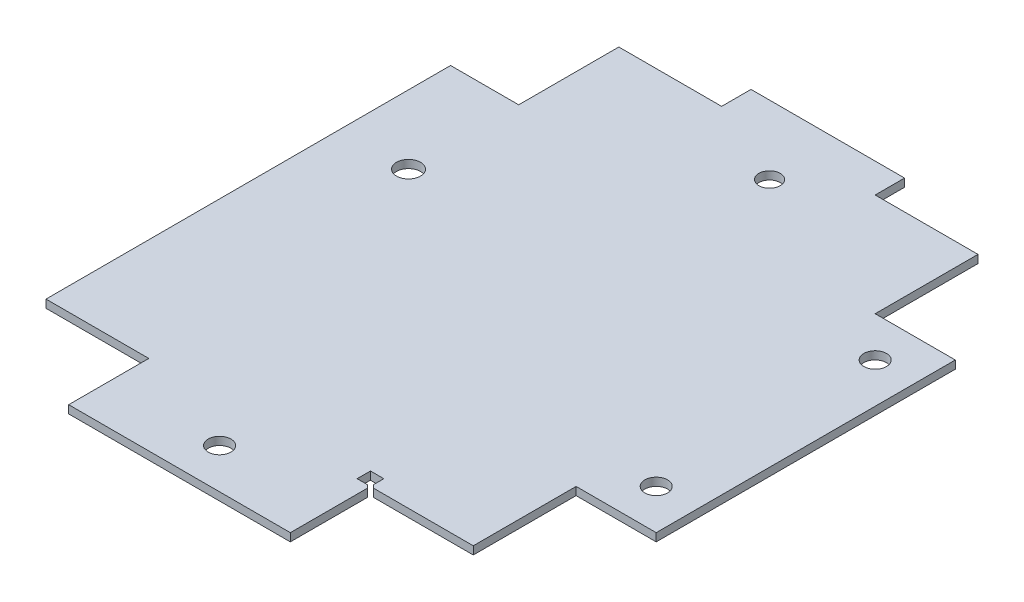
ISO-10303-21;
HEADER;
FILE_DESCRIPTION(('STEP AP214'),'2;1');
FILE_NAME('part.step','',(''),(''),'','','');
FILE_SCHEMA(('AUTOMOTIVE_DESIGN { 1 0 10303 214 1 1 1 1 }'));
ENDSEC;
DATA;
#1=APPLICATION_CONTEXT('core data for automotive mechanical design processes');
#2=APPLICATION_PROTOCOL_DEFINITION('international standard','automotive_design',2000,#1);
#3=PRODUCT_CONTEXT('',#1,'mechanical');
#4=PRODUCT('Part','Part','',(#3));
#5=PRODUCT_RELATED_PRODUCT_CATEGORY('part','',(#4));
#6=PRODUCT_DEFINITION_FORMATION('','',#4);
#7=PRODUCT_DEFINITION_CONTEXT('part definition',#1,'design');
#8=PRODUCT_DEFINITION('design','',#6,#7);
#9=PRODUCT_DEFINITION_SHAPE('','',#8);
#10=(LENGTH_UNIT() NAMED_UNIT(*) SI_UNIT(.MILLI.,.METRE.));
#11=(NAMED_UNIT(*) PLANE_ANGLE_UNIT() SI_UNIT($,.RADIAN.));
#12=(NAMED_UNIT(*) SI_UNIT($,.STERADIAN.) SOLID_ANGLE_UNIT());
#13=UNCERTAINTY_MEASURE_WITH_UNIT(LENGTH_MEASURE(1.E-05),#10,'distance_accuracy_value','');
#14=(GEOMETRIC_REPRESENTATION_CONTEXT(3) GLOBAL_UNCERTAINTY_ASSIGNED_CONTEXT((#13)) GLOBAL_UNIT_ASSIGNED_CONTEXT((#10,
#11,#12)) REPRESENTATION_CONTEXT('',''));
#15=CARTESIAN_POINT('',(0.,0.,0.));
#16=DIRECTION('',(0.,0.,1.));
#17=DIRECTION('',(1.,0.,0.));
#18=AXIS2_PLACEMENT_3D('',#15,#16,#17);
#19=CARTESIAN_POINT('',(94.9999999999999,3.,-115.));
#20=DIRECTION('',(-1.,0.,0.));
#21=DIRECTION('',(0.,0.,1.));
#22=AXIS2_PLACEMENT_3D('',#19,#20,#21);
#23=PLANE('',#22);
#24=DIRECTION('',(0.,0.,-1.));
#25=VECTOR('',#24,1.);
#26=CARTESIAN_POINT('',(94.9999999999999,0.,-115.));
#27=LINE('',#26,#25);
#28=CARTESIAN_POINT('',(95.,0.,46.5));
#29=VERTEX_POINT('',#28);
#30=CARTESIAN_POINT('',(94.9999999999999,0.,-65.5));
#31=VERTEX_POINT('',#30);
#32=EDGE_CURVE('E242',#29,#31,#27,.T.);
#33=ORIENTED_EDGE('',*,*,#32,.T.);
#34=DIRECTION('',(0.,1.,0.));
#35=VECTOR('',#34,1.);
#36=CARTESIAN_POINT('',(94.9999999999999,-7.,-65.5));
#37=LINE('',#36,#35);
#38=CARTESIAN_POINT('',(94.9999999999999,3.,-65.5));
#39=VERTEX_POINT('',#38);
#40=EDGE_CURVE('E477',#31,#39,#37,.T.);
#41=ORIENTED_EDGE('',*,*,#40,.T.);
#42=DIRECTION('',(0.,0.,-1.));
#43=VECTOR('',#42,1.);
#44=CARTESIAN_POINT('',(94.9999999999999,3.,-115.));
#45=LINE('',#44,#43);
#46=CARTESIAN_POINT('',(95.,3.,46.5));
#47=VERTEX_POINT('',#46);
#48=EDGE_CURVE('E227',#47,#39,#45,.T.);
#49=ORIENTED_EDGE('',*,*,#48,.F.);
#50=DIRECTION('',(0.,1.,0.));
#51=VECTOR('',#50,1.);
#52=CARTESIAN_POINT('',(95.,-7.,46.5));
#53=LINE('',#52,#51);
#54=EDGE_CURVE('E432',#29,#47,#53,.T.);
#55=ORIENTED_EDGE('',*,*,#54,.F.);
#56=EDGE_LOOP('',(#33,#41,#49,#55));
#57=FACE_BOUND('',#56,.T.);
#58=ADVANCED_FACE('F40',(#57),#23,.F.);
#59=CARTESIAN_POINT('',(-95.0000000000001,3.,-115.));
#60=DIRECTION('',(0.,0.,1.));
#61=DIRECTION('',(1.,0.,0.));
#62=AXIS2_PLACEMENT_3D('',#59,#60,#61);
#63=PLANE('',#62);
#64=DIRECTION('',(-1.,0.,0.));
#65=VECTOR('',#64,1.);
#66=CARTESIAN_POINT('',(-95.0000000000001,3.,-115.));
#67=LINE('',#66,#65);
#68=CARTESIAN_POINT('',(26.4999999999999,3.,-115.));
#69=VERTEX_POINT('',#68);
#70=CARTESIAN_POINT('',(-31.0000000000001,3.,-115.));
#71=VERTEX_POINT('',#70);
#72=EDGE_CURVE('E216',#69,#71,#67,.T.);
#73=ORIENTED_EDGE('',*,*,#72,.F.);
#74=DIRECTION('',(0.,1.,0.));
#75=VECTOR('',#74,1.);
#76=CARTESIAN_POINT('',(26.4999999999999,-27.,-115.));
#77=LINE('',#76,#75);
#78=CARTESIAN_POINT('',(26.4999999999999,0.,-115.));
#79=VERTEX_POINT('',#78);
#80=EDGE_CURVE('E201',#79,#69,#77,.T.);
#81=ORIENTED_EDGE('',*,*,#80,.F.);
#82=DIRECTION('',(-1.,0.,0.));
#83=VECTOR('',#82,1.);
#84=CARTESIAN_POINT('',(-95.0000000000001,0.,-115.));
#85=LINE('',#84,#83);
#86=CARTESIAN_POINT('',(-31.0000000000001,0.,-115.));
#87=VERTEX_POINT('',#86);
#88=EDGE_CURVE('E246',#79,#87,#85,.T.);
#89=ORIENTED_EDGE('',*,*,#88,.T.);
#90=DIRECTION('',(0.,1.,0.));
#91=VECTOR('',#90,1.);
#92=CARTESIAN_POINT('',(-31.0000000000001,-7.,-115.));
#93=LINE('',#92,#91);
#94=EDGE_CURVE('E224',#87,#71,#93,.T.);
#95=ORIENTED_EDGE('',*,*,#94,.T.);
#96=EDGE_LOOP('',(#73,#81,#89,#95));
#97=FACE_BOUND('',#96,.T.);
#98=ADVANCED_FACE('F222',(#97),#63,.F.);
#99=CARTESIAN_POINT('',(-95.0000000000001,3.,-115.));
#100=DIRECTION('',(1.,0.,0.));
#101=DIRECTION('',(0.,0.,-1.));
#102=AXIS2_PLACEMENT_3D('',#99,#100,#101);
#103=PLANE('',#102);
#104=DIRECTION('',(0.,0.,1.));
#105=VECTOR('',#104,1.);
#106=CARTESIAN_POINT('',(-95.0000000000001,3.,-115.));
#107=LINE('',#106,#105);
#108=CARTESIAN_POINT('',(-95.0000000000001,3.,-66.5));
#109=VERTEX_POINT('',#108);
#110=CARTESIAN_POINT('',(-95.,3.,85.));
#111=VERTEX_POINT('',#110);
#112=EDGE_CURVE('E226',#109,#111,#107,.T.);
#113=ORIENTED_EDGE('',*,*,#112,.F.);
#114=DIRECTION('',(0.,1.,0.));
#115=VECTOR('',#114,1.);
#116=CARTESIAN_POINT('',(-95.0000000000001,-7.,-66.5));
#117=LINE('',#116,#115);
#118=CARTESIAN_POINT('',(-95.0000000000001,0.,-66.5));
#119=VERTEX_POINT('',#118);
#120=EDGE_CURVE('E354',#119,#109,#117,.T.);
#121=ORIENTED_EDGE('',*,*,#120,.F.);
#122=DIRECTION('',(0.,0.,1.));
#123=VECTOR('',#122,1.);
#124=CARTESIAN_POINT('',(-95.0000000000001,0.,-115.));
#125=LINE('',#124,#123);
#126=CARTESIAN_POINT('',(-95.,0.,85.));
#127=VERTEX_POINT('',#126);
#128=EDGE_CURVE('E250',#119,#127,#125,.T.);
#129=ORIENTED_EDGE('',*,*,#128,.T.);
#130=DIRECTION('',(0.,1.,0.));
#131=VECTOR('',#130,1.);
#132=CARTESIAN_POINT('',(-95.,-7.,85.));
#133=LINE('',#132,#131);
#134=EDGE_CURVE('E416',#127,#111,#133,.T.);
#135=ORIENTED_EDGE('',*,*,#134,.T.);
#136=EDGE_LOOP('',(#113,#121,#129,#135));
#137=FACE_BOUND('',#136,.T.);
#138=ADVANCED_FACE('F536',(#137),#103,.F.);
#139=CARTESIAN_POINT('',(-95.,3.,115.));
#140=DIRECTION('',(0.,0.,-1.));
#141=DIRECTION('',(-1.,0.,0.));
#142=AXIS2_PLACEMENT_3D('',#139,#140,#141);
#143=PLANE('',#142);
#144=DIRECTION('',(1.,0.,0.));
#145=VECTOR('',#144,1.);
#146=CARTESIAN_POINT('',(-95.,3.,115.));
#147=LINE('',#146,#145);
#148=CARTESIAN_POINT('',(-56.5,3.,115.));
#149=VERTEX_POINT('',#148);
#150=CARTESIAN_POINT('',(26.5,3.,115.));
#151=VERTEX_POINT('',#150);
#152=EDGE_CURVE('E231',#149,#151,#147,.T.);
#153=ORIENTED_EDGE('',*,*,#152,.F.);
#154=DIRECTION('',(0.,1.,0.));
#155=VECTOR('',#154,1.);
#156=CARTESIAN_POINT('',(-56.5,-7.,115.));
#157=LINE('',#156,#155);
#158=CARTESIAN_POINT('',(-56.5,0.,115.));
#159=VERTEX_POINT('',#158);
#160=EDGE_CURVE('E415',#159,#149,#157,.T.);
#161=ORIENTED_EDGE('',*,*,#160,.F.);
#162=DIRECTION('',(1.,0.,0.));
#163=VECTOR('',#162,1.);
#164=CARTESIAN_POINT('',(-95.,0.,115.));
#165=LINE('',#164,#163);
#166=CARTESIAN_POINT('',(26.5,0.,115.));
#167=VERTEX_POINT('',#166);
#168=EDGE_CURVE('E234',#159,#167,#165,.T.);
#169=ORIENTED_EDGE('',*,*,#168,.T.);
#170=DIRECTION('',(0.,1.,0.));
#171=VECTOR('',#170,1.);
#172=CARTESIAN_POINT('',(26.5,-7.,115.));
#173=LINE('',#172,#171);
#174=EDGE_CURVE('E445',#167,#151,#173,.T.);
#175=ORIENTED_EDGE('',*,*,#174,.T.);
#176=EDGE_LOOP('',(#153,#161,#169,#175));
#177=FACE_BOUND('',#176,.T.);
#178=ADVANCED_FACE('F548',(#177),#143,.F.);
#179=CARTESIAN_POINT('',(0.,3.,0.));
#180=DIRECTION('',(0.,1.,0.));
#181=DIRECTION('',(0.,0.,1.));
#182=AXIS2_PLACEMENT_3D('',#179,#180,#181);
#183=PLANE('',#182);
#184=DIRECTION('',(1.,0.,0.));
#185=VECTOR('',#184,1.);
#186=CARTESIAN_POINT('',(64.9999999999999,3.,-104.));
#187=LINE('',#186,#185);
#188=CARTESIAN_POINT('',(26.4999999999999,3.,-104.));
#189=VERTEX_POINT('',#188);
#190=CARTESIAN_POINT('',(64.9999999999999,3.,-104.));
#191=VERTEX_POINT('',#190);
#192=EDGE_CURVE('E55',#189,#191,#187,.T.);
#193=ORIENTED_EDGE('',*,*,#192,.F.);
#194=DIRECTION('',(0.,0.,1.));
#195=VECTOR('',#194,1.);
#196=CARTESIAN_POINT('',(26.4999999999999,3.,-115.));
#197=LINE('',#196,#195);
#198=EDGE_CURVE('E205',#69,#189,#197,.T.);
#199=ORIENTED_EDGE('',*,*,#198,.F.);
#200=ORIENTED_EDGE('',*,*,#72,.T.);
#201=DIRECTION('',(0.,0.,-1.));
#202=VECTOR('',#201,1.);
#203=CARTESIAN_POINT('',(-31.0000000000001,3.,-104.));
#204=LINE('',#203,#202);
#205=CARTESIAN_POINT('',(-31.0000000000001,3.,-104.));
#206=VERTEX_POINT('',#205);
#207=EDGE_CURVE('E314',#206,#71,#204,.T.);
#208=ORIENTED_EDGE('',*,*,#207,.F.);
#209=DIRECTION('',(1.,0.,0.));
#210=VECTOR('',#209,1.);
#211=CARTESIAN_POINT('',(-69.5000000000001,3.,-104.));
#212=LINE('',#211,#210);
#213=CARTESIAN_POINT('',(-69.5000000000001,3.,-104.));
#214=VERTEX_POINT('',#213);
#215=EDGE_CURVE('E509',#214,#206,#212,.T.);
#216=ORIENTED_EDGE('',*,*,#215,.F.);
#217=DIRECTION('',(0.,0.,-1.));
#218=VECTOR('',#217,1.);
#219=CARTESIAN_POINT('',(-69.5000000000001,3.,-115.));
#220=LINE('',#219,#218);
#221=CARTESIAN_POINT('',(-69.5000000000001,3.,-66.5));
#222=VERTEX_POINT('',#221);
#223=EDGE_CURVE('E521',#222,#214,#220,.T.);
#224=ORIENTED_EDGE('',*,*,#223,.F.);
#225=DIRECTION('',(1.,0.,0.));
#226=VECTOR('',#225,1.);
#227=CARTESIAN_POINT('',(-95.0000000000001,3.,-66.5));
#228=LINE('',#227,#226);
#229=EDGE_CURVE('E517',#109,#222,#228,.T.);
#230=ORIENTED_EDGE('',*,*,#229,.F.);
#231=ORIENTED_EDGE('',*,*,#112,.T.);
#232=DIRECTION('',(-1.,0.,0.));
#233=VECTOR('',#232,1.);
#234=CARTESIAN_POINT('',(-95.,3.,85.));
#235=LINE('',#234,#233);
#236=CARTESIAN_POINT('',(-56.5,3.,85.));
#237=VERTEX_POINT('',#236);
#238=EDGE_CURVE('E411',#237,#111,#235,.T.);
#239=ORIENTED_EDGE('',*,*,#238,.F.);
#240=DIRECTION('',(0.,0.,-1.));
#241=VECTOR('',#240,1.);
#242=CARTESIAN_POINT('',(-56.5,3.,115.));
#243=LINE('',#242,#241);
#244=EDGE_CURVE('E407',#149,#237,#243,.T.);
#245=ORIENTED_EDGE('',*,*,#244,.F.);
#246=ORIENTED_EDGE('',*,*,#152,.T.);
#247=DIRECTION('',(0.,0.,1.));
#248=VECTOR('',#247,1.);
#249=CARTESIAN_POINT('',(26.5,3.,115.));
#250=LINE('',#249,#248);
#251=CARTESIAN_POINT('',(26.5,3.,86.1035533905932));
#252=VERTEX_POINT('',#251);
#253=EDGE_CURVE('E442',#252,#151,#250,.T.);
#254=ORIENTED_EDGE('',*,*,#253,.F.);
#255=DIRECTION('',(0.707106781186547,0.,0.707106781186547));
#256=VECTOR('',#255,1.);
#257=CARTESIAN_POINT('',(26.3232233047034,3.,85.9267766952966));
#258=LINE('',#257,#256);
#259=CARTESIAN_POINT('',(25.3964466094067,3.,85.));
#260=VERTEX_POINT('',#259);
#261=EDGE_CURVE('E372',#260,#252,#258,.T.);
#262=ORIENTED_EDGE('',*,*,#261,.F.);
#263=DIRECTION('',(1.,0.,0.));
#264=VECTOR('',#263,1.);
#265=CARTESIAN_POINT('',(21.5,3.,85.));
#266=LINE('',#265,#264);
#267=CARTESIAN_POINT('',(21.5,3.,85.));
#268=VERTEX_POINT('',#267);
#269=EDGE_CURVE('E386',#268,#260,#266,.T.);
#270=ORIENTED_EDGE('',*,*,#269,.F.);
#271=DIRECTION('',(0.,0.,1.));
#272=VECTOR('',#271,1.);
#273=CARTESIAN_POINT('',(21.5,3.,80.));
#274=LINE('',#273,#272);
#275=CARTESIAN_POINT('',(21.5,3.,80.));
#276=VERTEX_POINT('',#275);
#277=EDGE_CURVE('E382',#276,#268,#274,.T.);
#278=ORIENTED_EDGE('',*,*,#277,.F.);
#279=DIRECTION('',(-1.,0.,0.));
#280=VECTOR('',#279,1.);
#281=CARTESIAN_POINT('',(21.5,3.,80.));
#282=LINE('',#281,#280);
#283=CARTESIAN_POINT('',(26.5,3.,80.));
#284=VERTEX_POINT('',#283);
#285=EDGE_CURVE('E378',#284,#276,#282,.T.);
#286=ORIENTED_EDGE('',*,*,#285,.F.);
#287=DIRECTION('',(0.,0.,-1.));
#288=VECTOR('',#287,1.);
#289=CARTESIAN_POINT('',(26.5,3.,80.));
#290=LINE('',#289,#288);
#291=CARTESIAN_POINT('',(26.5,3.,83.8964466094067));
#292=VERTEX_POINT('',#291);
#293=EDGE_CURVE('E375',#292,#284,#290,.T.);
#294=ORIENTED_EDGE('',*,*,#293,.F.);
#295=DIRECTION('',(-0.707106781186547,0.,-0.707106781186547));
#296=VECTOR('',#295,1.);
#297=CARTESIAN_POINT('',(26.6767766952966,3.,84.0732233047033));
#298=LINE('',#297,#296);
#299=CARTESIAN_POINT('',(27.6035533905933,3.,85.));
#300=VERTEX_POINT('',#299);
#301=EDGE_CURVE('E369',#300,#292,#298,.T.);
#302=ORIENTED_EDGE('',*,*,#301,.F.);
#303=DIRECTION('',(-1.,0.,0.));
#304=VECTOR('',#303,1.);
#305=CARTESIAN_POINT('',(95.,3.,85.));
#306=LINE('',#305,#304);
#307=CARTESIAN_POINT('',(65.,3.,85.));
#308=VERTEX_POINT('',#307);
#309=EDGE_CURVE('E247',#308,#300,#306,.T.);
#310=ORIENTED_EDGE('',*,*,#309,.F.);
#311=DIRECTION('',(0.,0.,1.));
#312=VECTOR('',#311,1.);
#313=CARTESIAN_POINT('',(65.,3.,85.));
#314=LINE('',#313,#312);
#315=CARTESIAN_POINT('',(65.,3.,46.5));
#316=VERTEX_POINT('',#315);
#317=EDGE_CURVE('E429',#316,#308,#314,.T.);
#318=ORIENTED_EDGE('',*,*,#317,.F.);
#319=DIRECTION('',(-1.,0.,0.));
#320=VECTOR('',#319,1.);
#321=CARTESIAN_POINT('',(95.,3.,46.5));
#322=LINE('',#321,#320);
#323=EDGE_CURVE('E420',#47,#316,#322,.T.);
#324=ORIENTED_EDGE('',*,*,#323,.F.);
#325=ORIENTED_EDGE('',*,*,#48,.T.);
#326=DIRECTION('',(1.,0.,0.));
#327=VECTOR('',#326,1.);
#328=CARTESIAN_POINT('',(64.9999999999999,3.,-65.5));
#329=LINE('',#328,#327);
#330=CARTESIAN_POINT('',(64.9999999999999,3.,-65.5));
#331=VERTEX_POINT('',#330);
#332=EDGE_CURVE('E334',#331,#39,#329,.T.);
#333=ORIENTED_EDGE('',*,*,#332,.F.);
#334=DIRECTION('',(0.,0.,1.));
#335=VECTOR('',#334,1.);
#336=CARTESIAN_POINT('',(64.9999999999999,3.,-115.));
#337=LINE('',#336,#335);
#338=EDGE_CURVE('E341',#191,#331,#337,.T.);
#339=ORIENTED_EDGE('',*,*,#338,.F.);
#340=EDGE_LOOP('',(#193,#199,#200,#208,#216,#224,#230,#231,#239,#245,#246,#254,#262,#270,#278,
#286,#294,#302,#310,#318,#324,#325,#333,#339));
#341=FACE_BOUND('',#340,.T.);
#342=CARTESIAN_POINT('',(80.,3.,-50.5));
#343=DIRECTION('',(0.,1.,0.));
#344=DIRECTION('',(0.,0.,1.));
#345=AXIS2_PLACEMENT_3D('',#342,#343,#344);
#346=CIRCLE('',#345,4.25000000000001);
#347=CARTESIAN_POINT('',(80.,3.,-46.25));
#348=VERTEX_POINT('',#347);
#349=EDGE_CURVE('E335',#348,#348,#346,.T.);
#350=ORIENTED_EDGE('',*,*,#349,.F.);
#351=EDGE_LOOP('',(#350));
#352=FACE_BOUND('',#351,.T.);
#353=CARTESIAN_POINT('',(1.70000000000001,3.,-89.25));
#354=DIRECTION('',(0.,1.,0.));
#355=DIRECTION('',(0.,0.,1.));
#356=AXIS2_PLACEMENT_3D('',#353,#354,#355);
#357=CIRCLE('',#356,4.);
#358=CARTESIAN_POINT('',(1.70000000000001,3.,-85.25));
#359=VERTEX_POINT('',#358);
#360=EDGE_CURVE('E330',#359,#359,#357,.T.);
#361=ORIENTED_EDGE('',*,*,#360,.F.);
#362=EDGE_LOOP('',(#361));
#363=FACE_BOUND('',#362,.T.);
#364=CARTESIAN_POINT('',(-69.2500000000001,3.,-25.));
#365=DIRECTION('',(0.,1.,0.));
#366=DIRECTION('',(0.,0.,1.));
#367=AXIS2_PLACEMENT_3D('',#364,#365,#366);
#368=CIRCLE('',#367,4.5);
#369=CARTESIAN_POINT('',(-69.2500000000001,3.,-20.5));
#370=VERTEX_POINT('',#369);
#371=EDGE_CURVE('E325',#370,#370,#368,.T.);
#372=ORIENTED_EDGE('',*,*,#371,.F.);
#373=EDGE_LOOP('',(#372));
#374=FACE_BOUND('',#373,.T.);
#375=CARTESIAN_POINT('',(-15.,3.,100.));
#376=DIRECTION('',(0.,1.,0.));
#377=DIRECTION('',(0.,0.,1.));
#378=AXIS2_PLACEMENT_3D('',#375,#376,#377);
#379=CIRCLE('',#378,4.25);
#380=CARTESIAN_POINT('',(-15.,3.,104.25));
#381=VERTEX_POINT('',#380);
#382=EDGE_CURVE('E320',#381,#381,#379,.T.);
#383=ORIENTED_EDGE('',*,*,#382,.F.);
#384=EDGE_LOOP('',(#383));
#385=FACE_BOUND('',#384,.T.);
#386=CARTESIAN_POINT('',(80.,3.,31.5));
#387=DIRECTION('',(0.,1.,0.));
#388=DIRECTION('',(0.,0.,1.));
#389=AXIS2_PLACEMENT_3D('',#386,#387,#388);
#390=CIRCLE('',#389,4.24999999999999);
#391=CARTESIAN_POINT('',(80.,3.,35.75));
#392=VERTEX_POINT('',#391);
#393=EDGE_CURVE('E315',#392,#392,#390,.T.);
#394=ORIENTED_EDGE('',*,*,#393,.F.);
#395=EDGE_LOOP('',(#394));
#396=FACE_BOUND('',#395,.T.);
#397=ADVANCED_FACE('F213',(#341,#352,#363,#374,#385,#396),#183,.T.);
#398=CARTESIAN_POINT('',(0.,0.,0.));
#399=DIRECTION('',(0.,1.,0.));
#400=DIRECTION('',(0.,0.,1.));
#401=AXIS2_PLACEMENT_3D('',#398,#399,#400);
#402=PLANE('',#401);
#403=CARTESIAN_POINT('',(80.,0.,-50.5));
#404=DIRECTION('',(0.,1.,0.));
#405=DIRECTION('',(0.,0.,1.));
#406=AXIS2_PLACEMENT_3D('',#403,#404,#405);
#407=CIRCLE('',#406,4.25000000000001);
#408=CARTESIAN_POINT('',(80.,0.,-46.25));
#409=VERTEX_POINT('',#408);
#410=EDGE_CURVE('E331',#409,#409,#407,.T.);
#411=ORIENTED_EDGE('',*,*,#410,.T.);
#412=EDGE_LOOP('',(#411));
#413=FACE_BOUND('',#412,.T.);
#414=CARTESIAN_POINT('',(1.70000000000001,0.,-89.25));
#415=DIRECTION('',(0.,1.,0.));
#416=DIRECTION('',(0.,0.,1.));
#417=AXIS2_PLACEMENT_3D('',#414,#415,#416);
#418=CIRCLE('',#417,4.);
#419=CARTESIAN_POINT('',(1.70000000000001,0.,-85.25));
#420=VERTEX_POINT('',#419);
#421=EDGE_CURVE('E326',#420,#420,#418,.T.);
#422=ORIENTED_EDGE('',*,*,#421,.T.);
#423=EDGE_LOOP('',(#422));
#424=FACE_BOUND('',#423,.T.);
#425=CARTESIAN_POINT('',(-69.2500000000001,0.,-25.));
#426=DIRECTION('',(0.,1.,0.));
#427=DIRECTION('',(0.,0.,1.));
#428=AXIS2_PLACEMENT_3D('',#425,#426,#427);
#429=CIRCLE('',#428,4.5);
#430=CARTESIAN_POINT('',(-69.2500000000001,0.,-20.5));
#431=VERTEX_POINT('',#430);
#432=EDGE_CURVE('E321',#431,#431,#429,.T.);
#433=ORIENTED_EDGE('',*,*,#432,.T.);
#434=EDGE_LOOP('',(#433));
#435=FACE_BOUND('',#434,.T.);
#436=CARTESIAN_POINT('',(-15.,0.,100.));
#437=DIRECTION('',(0.,1.,0.));
#438=DIRECTION('',(0.,0.,1.));
#439=AXIS2_PLACEMENT_3D('',#436,#437,#438);
#440=CIRCLE('',#439,4.25);
#441=CARTESIAN_POINT('',(-15.,0.,104.25));
#442=VERTEX_POINT('',#441);
#443=EDGE_CURVE('E316',#442,#442,#440,.T.);
#444=ORIENTED_EDGE('',*,*,#443,.T.);
#445=EDGE_LOOP('',(#444));
#446=FACE_BOUND('',#445,.T.);
#447=DIRECTION('',(0.,0.,1.));
#448=VECTOR('',#447,1.);
#449=CARTESIAN_POINT('',(26.4999999999999,0.,0.));
#450=LINE('',#449,#448);
#451=CARTESIAN_POINT('',(26.4999999999999,0.,-104.));
#452=VERTEX_POINT('',#451);
#453=EDGE_CURVE('E11',#79,#452,#450,.T.);
#454=ORIENTED_EDGE('',*,*,#453,.T.);
#455=DIRECTION('',(1.,0.,0.));
#456=VECTOR('',#455,1.);
#457=CARTESIAN_POINT('',(0.,0.,-104.));
#458=LINE('',#457,#456);
#459=CARTESIAN_POINT('',(64.9999999999999,0.,-104.));
#460=VERTEX_POINT('',#459);
#461=EDGE_CURVE('E824',#452,#460,#458,.T.);
#462=ORIENTED_EDGE('',*,*,#461,.T.);
#463=DIRECTION('',(0.,0.,1.));
#464=VECTOR('',#463,1.);
#465=CARTESIAN_POINT('',(65.,0.,0.));
#466=LINE('',#465,#464);
#467=CARTESIAN_POINT('',(64.9999999999999,0.,-65.5));
#468=VERTEX_POINT('',#467);
#469=EDGE_CURVE('E292',#460,#468,#466,.T.);
#470=ORIENTED_EDGE('',*,*,#469,.T.);
#471=DIRECTION('',(1.,0.,0.));
#472=VECTOR('',#471,1.);
#473=CARTESIAN_POINT('',(0.,0.,-65.5));
#474=LINE('',#473,#472);
#475=EDGE_CURVE('E482',#468,#31,#474,.T.);
#476=ORIENTED_EDGE('',*,*,#475,.T.);
#477=ORIENTED_EDGE('',*,*,#32,.F.);
#478=DIRECTION('',(-1.,0.,0.));
#479=VECTOR('',#478,1.);
#480=CARTESIAN_POINT('',(0.,0.,46.5));
#481=LINE('',#480,#479);
#482=CARTESIAN_POINT('',(65.,0.,46.5));
#483=VERTEX_POINT('',#482);
#484=EDGE_CURVE('E266',#29,#483,#481,.T.);
#485=ORIENTED_EDGE('',*,*,#484,.T.);
#486=DIRECTION('',(0.,0.,1.));
#487=VECTOR('',#486,1.);
#488=CARTESIAN_POINT('',(65.,0.,0.));
#489=LINE('',#488,#487);
#490=CARTESIAN_POINT('',(65.,0.,85.));
#491=VERTEX_POINT('',#490);
#492=EDGE_CURVE('E436',#483,#491,#489,.T.);
#493=ORIENTED_EDGE('',*,*,#492,.T.);
#494=DIRECTION('',(-1.,0.,0.));
#495=VECTOR('',#494,1.);
#496=CARTESIAN_POINT('',(0.,0.,85.));
#497=LINE('',#496,#495);
#498=CARTESIAN_POINT('',(27.6035533905933,0.,85.));
#499=VERTEX_POINT('',#498);
#500=EDGE_CURVE('E241',#491,#499,#497,.T.);
#501=ORIENTED_EDGE('',*,*,#500,.T.);
#502=DIRECTION('',(-0.707106781186548,0.,-0.707106781186548));
#503=VECTOR('',#502,1.);
#504=CARTESIAN_POINT('',(-28.6982233047033,0.,28.6982233047033));
#505=LINE('',#504,#503);
#506=CARTESIAN_POINT('',(26.5,0.,83.8964466094067));
#507=VERTEX_POINT('',#506);
#508=EDGE_CURVE('E289',#499,#507,#505,.T.);
#509=ORIENTED_EDGE('',*,*,#508,.T.);
#510=DIRECTION('',(0.,0.,-1.));
#511=VECTOR('',#510,1.);
#512=CARTESIAN_POINT('',(26.5,0.,0.));
#513=LINE('',#512,#511);
#514=CARTESIAN_POINT('',(26.5,0.,80.));
#515=VERTEX_POINT('',#514);
#516=EDGE_CURVE('E404',#507,#515,#513,.T.);
#517=ORIENTED_EDGE('',*,*,#516,.T.);
#518=DIRECTION('',(-1.,0.,0.));
#519=VECTOR('',#518,1.);
#520=CARTESIAN_POINT('',(0.,0.,80.));
#521=LINE('',#520,#519);
#522=CARTESIAN_POINT('',(21.5,0.,80.));
#523=VERTEX_POINT('',#522);
#524=EDGE_CURVE('E278',#515,#523,#521,.T.);
#525=ORIENTED_EDGE('',*,*,#524,.T.);
#526=DIRECTION('',(0.,0.,1.));
#527=VECTOR('',#526,1.);
#528=CARTESIAN_POINT('',(21.5,0.,0.));
#529=LINE('',#528,#527);
#530=CARTESIAN_POINT('',(21.5,0.,85.));
#531=VERTEX_POINT('',#530);
#532=EDGE_CURVE('E282',#523,#531,#529,.T.);
#533=ORIENTED_EDGE('',*,*,#532,.T.);
#534=DIRECTION('',(1.,0.,0.));
#535=VECTOR('',#534,1.);
#536=CARTESIAN_POINT('',(0.,0.,85.));
#537=LINE('',#536,#535);
#538=CARTESIAN_POINT('',(25.3964466094067,0.,85.));
#539=VERTEX_POINT('',#538);
#540=EDGE_CURVE('E394',#531,#539,#537,.T.);
#541=ORIENTED_EDGE('',*,*,#540,.T.);
#542=DIRECTION('',(0.707106781186548,0.,0.707106781186548));
#543=VECTOR('',#542,1.);
#544=CARTESIAN_POINT('',(-29.8017766952966,0.,29.8017766952966));
#545=LINE('',#544,#543);
#546=CARTESIAN_POINT('',(26.5,0.,86.1035533905932));
#547=VERTEX_POINT('',#546);
#548=EDGE_CURVE('E286',#539,#547,#545,.T.);
#549=ORIENTED_EDGE('',*,*,#548,.T.);
#550=DIRECTION('',(0.,0.,1.));
#551=VECTOR('',#550,1.);
#552=CARTESIAN_POINT('',(26.5,0.,0.));
#553=LINE('',#552,#551);
#554=EDGE_CURVE('E259',#547,#167,#553,.T.);
#555=ORIENTED_EDGE('',*,*,#554,.T.);
#556=ORIENTED_EDGE('',*,*,#168,.F.);
#557=DIRECTION('',(0.,0.,-1.));
#558=VECTOR('',#557,1.);
#559=CARTESIAN_POINT('',(-56.5,0.,0.));
#560=LINE('',#559,#558);
#561=CARTESIAN_POINT('',(-56.5,0.,85.));
#562=VERTEX_POINT('',#561);
#563=EDGE_CURVE('E270',#159,#562,#560,.T.);
#564=ORIENTED_EDGE('',*,*,#563,.T.);
#565=DIRECTION('',(-1.,0.,0.));
#566=VECTOR('',#565,1.);
#567=CARTESIAN_POINT('',(0.,0.,85.));
#568=LINE('',#567,#566);
#569=EDGE_CURVE('E274',#562,#127,#568,.T.);
#570=ORIENTED_EDGE('',*,*,#569,.T.);
#571=ORIENTED_EDGE('',*,*,#128,.F.);
#572=DIRECTION('',(1.,0.,0.));
#573=VECTOR('',#572,1.);
#574=CARTESIAN_POINT('',(0.,0.,-66.5000000000001));
#575=LINE('',#574,#573);
#576=CARTESIAN_POINT('',(-69.5000000000001,0.,-66.5));
#577=VERTEX_POINT('',#576);
#578=EDGE_CURVE('E295',#119,#577,#575,.T.);
#579=ORIENTED_EDGE('',*,*,#578,.T.);
#580=DIRECTION('',(0.,0.,-1.));
#581=VECTOR('',#580,1.);
#582=CARTESIAN_POINT('',(-69.5000000000001,0.,0.));
#583=LINE('',#582,#581);
#584=CARTESIAN_POINT('',(-69.5000000000001,0.,-104.));
#585=VERTEX_POINT('',#584);
#586=EDGE_CURVE('E299',#577,#585,#583,.T.);
#587=ORIENTED_EDGE('',*,*,#586,.T.);
#588=DIRECTION('',(1.,0.,0.));
#589=VECTOR('',#588,1.);
#590=CARTESIAN_POINT('',(0.,0.,-104.));
#591=LINE('',#590,#589);
#592=CARTESIAN_POINT('',(-31.0000000000001,0.,-104.));
#593=VERTEX_POINT('',#592);
#594=EDGE_CURVE('E63',#585,#593,#591,.T.);
#595=ORIENTED_EDGE('',*,*,#594,.T.);
#596=DIRECTION('',(0.,0.,-1.));
#597=VECTOR('',#596,1.);
#598=CARTESIAN_POINT('',(-31.0000000000001,0.,0.));
#599=LINE('',#598,#597);
#600=EDGE_CURVE('E306',#593,#87,#599,.T.);
#601=ORIENTED_EDGE('',*,*,#600,.T.);
#602=ORIENTED_EDGE('',*,*,#88,.F.);
#603=EDGE_LOOP('',(#454,#462,#470,#476,#477,#485,#493,#501,#509,#517,#525,#533,#541,#549,#555,
#556,#564,#570,#571,#579,#587,#595,#601,#602));
#604=FACE_BOUND('',#603,.T.);
#605=CARTESIAN_POINT('',(80.,0.,31.5));
#606=DIRECTION('',(0.,1.,0.));
#607=DIRECTION('',(0.,0.,1.));
#608=AXIS2_PLACEMENT_3D('',#605,#606,#607);
#609=CIRCLE('',#608,4.24999999999999);
#610=CARTESIAN_POINT('',(80.,0.,35.75));
#611=VERTEX_POINT('',#610);
#612=EDGE_CURVE('E310',#611,#611,#609,.T.);
#613=ORIENTED_EDGE('',*,*,#612,.T.);
#614=EDGE_LOOP('',(#613));
#615=FACE_BOUND('',#614,.T.);
#616=ADVANCED_FACE('F464',(#413,#424,#435,#446,#604,#615),#402,.F.);
#617=CARTESIAN_POINT('',(95.,-7.,85.));
#618=DIRECTION('',(0.,0.,-1.));
#619=DIRECTION('',(-1.,0.,0.));
#620=AXIS2_PLACEMENT_3D('',#617,#618,#619);
#621=PLANE('',#620);
#622=ORIENTED_EDGE('',*,*,#309,.T.);
#623=DIRECTION('',(0.,-1.,0.));
#624=VECTOR('',#623,1.);
#625=CARTESIAN_POINT('',(27.6035533905933,-7.,85.));
#626=LINE('',#625,#624);
#627=EDGE_CURVE('E352',#300,#499,#626,.T.);
#628=ORIENTED_EDGE('',*,*,#627,.T.);
#629=ORIENTED_EDGE('',*,*,#500,.F.);
#630=DIRECTION('',(0.,1.,0.));
#631=VECTOR('',#630,1.);
#632=CARTESIAN_POINT('',(65.,-7.,85.));
#633=LINE('',#632,#631);
#634=EDGE_CURVE('E262',#491,#308,#633,.T.);
#635=ORIENTED_EDGE('',*,*,#634,.T.);
#636=EDGE_LOOP('',(#622,#628,#629,#635));
#637=FACE_BOUND('',#636,.T.);
#638=ADVANCED_FACE('F452',(#637),#621,.F.);
#639=CARTESIAN_POINT('',(26.5,-7.,115.));
#640=DIRECTION('',(-1.,0.,0.));
#641=DIRECTION('',(0.,0.,1.));
#642=AXIS2_PLACEMENT_3D('',#639,#640,#641);
#643=PLANE('',#642);
#644=ORIENTED_EDGE('',*,*,#554,.F.);
#645=DIRECTION('',(0.,1.,0.));
#646=VECTOR('',#645,1.);
#647=CARTESIAN_POINT('',(26.5,-7.,86.1035533905932));
#648=LINE('',#647,#646);
#649=EDGE_CURVE('E365',#547,#252,#648,.T.);
#650=ORIENTED_EDGE('',*,*,#649,.T.);
#651=ORIENTED_EDGE('',*,*,#253,.T.);
#652=ORIENTED_EDGE('',*,*,#174,.F.);
#653=EDGE_LOOP('',(#644,#650,#651,#652));
#654=FACE_BOUND('',#653,.T.);
#655=ADVANCED_FACE('F555',(#654),#643,.F.);
#656=CARTESIAN_POINT('',(95.,-7.,46.5));
#657=DIRECTION('',(0.,0.,-1.));
#658=DIRECTION('',(-1.,0.,0.));
#659=AXIS2_PLACEMENT_3D('',#656,#657,#658);
#660=PLANE('',#659);
#661=ORIENTED_EDGE('',*,*,#54,.T.);
#662=ORIENTED_EDGE('',*,*,#323,.T.);
#663=DIRECTION('',(0.,1.,0.));
#664=VECTOR('',#663,1.);
#665=CARTESIAN_POINT('',(65.,-7.,46.5));
#666=LINE('',#665,#664);
#667=EDGE_CURVE('E433',#483,#316,#666,.T.);
#668=ORIENTED_EDGE('',*,*,#667,.F.);
#669=ORIENTED_EDGE('',*,*,#484,.F.);
#670=EDGE_LOOP('',(#661,#662,#668,#669));
#671=FACE_BOUND('',#670,.T.);
#672=ADVANCED_FACE('F472',(#671),#660,.F.);
#673=CARTESIAN_POINT('',(65.,-7.,85.));
#674=DIRECTION('',(-1.,0.,0.));
#675=DIRECTION('',(0.,0.,1.));
#676=AXIS2_PLACEMENT_3D('',#673,#674,#675);
#677=PLANE('',#676);
#678=ORIENTED_EDGE('',*,*,#667,.T.);
#679=ORIENTED_EDGE('',*,*,#317,.T.);
#680=ORIENTED_EDGE('',*,*,#634,.F.);
#681=ORIENTED_EDGE('',*,*,#492,.F.);
#682=EDGE_LOOP('',(#678,#679,#680,#681));
#683=FACE_BOUND('',#682,.T.);
#684=ADVANCED_FACE('F470',(#683),#677,.F.);
#685=CARTESIAN_POINT('',(-95.,-7.,85.));
#686=DIRECTION('',(0.,0.,-1.));
#687=DIRECTION('',(-1.,0.,0.));
#688=AXIS2_PLACEMENT_3D('',#685,#686,#687);
#689=PLANE('',#688);
#690=DIRECTION('',(0.,1.,0.));
#691=VECTOR('',#690,1.);
#692=CARTESIAN_POINT('',(-56.5,-7.,85.));
#693=LINE('',#692,#691);
#694=EDGE_CURVE('E421',#562,#237,#693,.T.);
#695=ORIENTED_EDGE('',*,*,#694,.T.);
#696=ORIENTED_EDGE('',*,*,#238,.T.);
#697=ORIENTED_EDGE('',*,*,#134,.F.);
#698=ORIENTED_EDGE('',*,*,#569,.F.);
#699=EDGE_LOOP('',(#695,#696,#697,#698));
#700=FACE_BOUND('',#699,.T.);
#701=ADVANCED_FACE('F540',(#700),#689,.F.);
#702=CARTESIAN_POINT('',(-56.5,-7.,115.));
#703=DIRECTION('',(1.,0.,0.));
#704=DIRECTION('',(0.,0.,-1.));
#705=AXIS2_PLACEMENT_3D('',#702,#703,#704);
#706=PLANE('',#705);
#707=ORIENTED_EDGE('',*,*,#160,.T.);
#708=ORIENTED_EDGE('',*,*,#244,.T.);
#709=ORIENTED_EDGE('',*,*,#694,.F.);
#710=ORIENTED_EDGE('',*,*,#563,.F.);
#711=EDGE_LOOP('',(#707,#708,#709,#710));
#712=FACE_BOUND('',#711,.T.);
#713=ADVANCED_FACE('F544',(#712),#706,.F.);
#714=CARTESIAN_POINT('',(21.5,-7.,80.));
#715=DIRECTION('',(-1.,0.,0.));
#716=DIRECTION('',(0.,0.,1.));
#717=AXIS2_PLACEMENT_3D('',#714,#715,#716);
#718=PLANE('',#717);
#719=DIRECTION('',(0.,1.,0.));
#720=VECTOR('',#719,1.);
#721=CARTESIAN_POINT('',(21.5,-7.,80.));
#722=LINE('',#721,#720);
#723=EDGE_CURVE('E395',#523,#276,#722,.T.);
#724=ORIENTED_EDGE('',*,*,#723,.T.);
#725=ORIENTED_EDGE('',*,*,#277,.T.);
#726=DIRECTION('',(0.,1.,0.));
#727=VECTOR('',#726,1.);
#728=CARTESIAN_POINT('',(21.5,-7.,85.));
#729=LINE('',#728,#727);
#730=EDGE_CURVE('E391',#531,#268,#729,.T.);
#731=ORIENTED_EDGE('',*,*,#730,.F.);
#732=ORIENTED_EDGE('',*,*,#532,.F.);
#733=EDGE_LOOP('',(#724,#725,#731,#732));
#734=FACE_BOUND('',#733,.T.);
#735=ADVANCED_FACE('F564',(#734),#718,.F.);
#736=CARTESIAN_POINT('',(21.5,-7.,80.));
#737=DIRECTION('',(0.,0.,-1.));
#738=DIRECTION('',(-1.,0.,0.));
#739=AXIS2_PLACEMENT_3D('',#736,#737,#738);
#740=PLANE('',#739);
#741=DIRECTION('',(0.,1.,0.));
#742=VECTOR('',#741,1.);
#743=CARTESIAN_POINT('',(26.5,-7.,80.));
#744=LINE('',#743,#742);
#745=EDGE_CURVE('E390',#515,#284,#744,.T.);
#746=ORIENTED_EDGE('',*,*,#745,.T.);
#747=ORIENTED_EDGE('',*,*,#285,.T.);
#748=ORIENTED_EDGE('',*,*,#723,.F.);
#749=ORIENTED_EDGE('',*,*,#524,.F.);
#750=EDGE_LOOP('',(#746,#747,#748,#749));
#751=FACE_BOUND('',#750,.T.);
#752=ADVANCED_FACE('F567',(#751),#740,.F.);
#753=CARTESIAN_POINT('',(26.5,-7.,80.));
#754=DIRECTION('',(1.,0.,0.));
#755=DIRECTION('',(0.,0.,-1.));
#756=AXIS2_PLACEMENT_3D('',#753,#754,#755);
#757=PLANE('',#756);
#758=ORIENTED_EDGE('',*,*,#516,.F.);
#759=DIRECTION('',(0.,1.,0.));
#760=VECTOR('',#759,1.);
#761=CARTESIAN_POINT('',(26.5,-7.,83.8964466094067));
#762=LINE('',#761,#760);
#763=EDGE_CURVE('E346',#507,#292,#762,.T.);
#764=ORIENTED_EDGE('',*,*,#763,.T.);
#765=ORIENTED_EDGE('',*,*,#293,.T.);
#766=ORIENTED_EDGE('',*,*,#745,.F.);
#767=EDGE_LOOP('',(#758,#764,#765,#766));
#768=FACE_BOUND('',#767,.T.);
#769=ADVANCED_FACE('F570',(#768),#757,.F.);
#770=CARTESIAN_POINT('',(21.5,-7.,85.));
#771=DIRECTION('',(0.,0.,1.));
#772=DIRECTION('',(1.,0.,0.));
#773=AXIS2_PLACEMENT_3D('',#770,#771,#772);
#774=PLANE('',#773);
#775=ORIENTED_EDGE('',*,*,#269,.T.);
#776=DIRECTION('',(0.,-1.,0.));
#777=VECTOR('',#776,1.);
#778=CARTESIAN_POINT('',(25.3964466094067,-7.,85.));
#779=LINE('',#778,#777);
#780=EDGE_CURVE('E361',#260,#539,#779,.T.);
#781=ORIENTED_EDGE('',*,*,#780,.T.);
#782=ORIENTED_EDGE('',*,*,#540,.F.);
#783=ORIENTED_EDGE('',*,*,#730,.T.);
#784=EDGE_LOOP('',(#775,#781,#782,#783));
#785=FACE_BOUND('',#784,.T.);
#786=ADVANCED_FACE('F560',(#785),#774,.F.);
#787=CARTESIAN_POINT('',(26.3232233047034,-7.,85.9267766952966));
#788=DIRECTION('',(-0.707106781186548,0.,0.707106781186548));
#789=DIRECTION('',(0.707106781186548,0.,0.707106781186548));
#790=AXIS2_PLACEMENT_3D('',#787,#788,#789);
#791=PLANE('',#790);
#792=ORIENTED_EDGE('',*,*,#548,.F.);
#793=ORIENTED_EDGE('',*,*,#780,.F.);
#794=ORIENTED_EDGE('',*,*,#261,.T.);
#795=ORIENTED_EDGE('',*,*,#649,.F.);
#796=EDGE_LOOP('',(#792,#793,#794,#795));
#797=FACE_BOUND('',#796,.T.);
#798=ADVANCED_FACE('F558',(#797),#791,.F.);
#799=CARTESIAN_POINT('',(26.6767766952966,-7.,84.0732233047033));
#800=DIRECTION('',(0.707106781186548,0.,-0.707106781186548));
#801=DIRECTION('',(-0.707106781186548,0.,-0.707106781186548));
#802=AXIS2_PLACEMENT_3D('',#799,#800,#801);
#803=PLANE('',#802);
#804=ORIENTED_EDGE('',*,*,#508,.F.);
#805=ORIENTED_EDGE('',*,*,#627,.F.);
#806=ORIENTED_EDGE('',*,*,#301,.T.);
#807=ORIENTED_EDGE('',*,*,#763,.F.);
#808=EDGE_LOOP('',(#804,#805,#806,#807));
#809=FACE_BOUND('',#808,.T.);
#810=ADVANCED_FACE('F461',(#809),#803,.F.);
#811=CARTESIAN_POINT('',(64.9999999999999,-7.,-115.));
#812=DIRECTION('',(-1.,0.,0.));
#813=DIRECTION('',(0.,0.,1.));
#814=AXIS2_PLACEMENT_3D('',#811,#812,#813);
#815=PLANE('',#814);
#816=ORIENTED_EDGE('',*,*,#469,.F.);
#817=DIRECTION('',(0.,1.,0.));
#818=VECTOR('',#817,1.);
#819=CARTESIAN_POINT('',(64.9999999999999,-7.,-104.));
#820=LINE('',#819,#818);
#821=EDGE_CURVE('E48',#460,#191,#820,.T.);
#822=ORIENTED_EDGE('',*,*,#821,.T.);
#823=ORIENTED_EDGE('',*,*,#338,.T.);
#824=DIRECTION('',(0.,1.,0.));
#825=VECTOR('',#824,1.);
#826=CARTESIAN_POINT('',(64.9999999999999,-7.,-65.5));
#827=LINE('',#826,#825);
#828=EDGE_CURVE('E483',#468,#331,#827,.T.);
#829=ORIENTED_EDGE('',*,*,#828,.F.);
#830=EDGE_LOOP('',(#816,#822,#823,#829));
#831=FACE_BOUND('',#830,.T.);
#832=ADVANCED_FACE('F339',(#831),#815,.F.);
#833=CARTESIAN_POINT('',(-69.5000000000001,-7.,-115.));
#834=DIRECTION('',(1.,0.,0.));
#835=DIRECTION('',(0.,0.,-1.));
#836=AXIS2_PLACEMENT_3D('',#833,#834,#835);
#837=PLANE('',#836);
#838=ORIENTED_EDGE('',*,*,#223,.T.);
#839=DIRECTION('',(0.,-1.,0.));
#840=VECTOR('',#839,1.);
#841=CARTESIAN_POINT('',(-69.5000000000001,-7.,-104.));
#842=LINE('',#841,#840);
#843=EDGE_CURVE('E303',#214,#585,#842,.T.);
#844=ORIENTED_EDGE('',*,*,#843,.T.);
#845=ORIENTED_EDGE('',*,*,#586,.F.);
#846=DIRECTION('',(0.,1.,0.));
#847=VECTOR('',#846,1.);
#848=CARTESIAN_POINT('',(-69.5000000000001,-7.,-66.5));
#849=LINE('',#848,#847);
#850=EDGE_CURVE('E347',#577,#222,#849,.T.);
#851=ORIENTED_EDGE('',*,*,#850,.T.);
#852=EDGE_LOOP('',(#838,#844,#845,#851));
#853=FACE_BOUND('',#852,.T.);
#854=ADVANCED_FACE('F692',(#853),#837,.F.);
#855=CARTESIAN_POINT('',(-95.0000000000001,-7.,-66.5));
#856=DIRECTION('',(0.,0.,1.));
#857=DIRECTION('',(1.,0.,0.));
#858=AXIS2_PLACEMENT_3D('',#855,#856,#857);
#859=PLANE('',#858);
#860=ORIENTED_EDGE('',*,*,#120,.T.);
#861=ORIENTED_EDGE('',*,*,#229,.T.);
#862=ORIENTED_EDGE('',*,*,#850,.F.);
#863=ORIENTED_EDGE('',*,*,#578,.F.);
#864=EDGE_LOOP('',(#860,#861,#862,#863));
#865=FACE_BOUND('',#864,.T.);
#866=ADVANCED_FACE('F530',(#865),#859,.F.);
#867=CARTESIAN_POINT('',(-69.5000000000001,-7.,-104.));
#868=DIRECTION('',(0.,0.,1.));
#869=DIRECTION('',(1.,0.,0.));
#870=AXIS2_PLACEMENT_3D('',#867,#868,#869);
#871=PLANE('',#870);
#872=ORIENTED_EDGE('',*,*,#843,.F.);
#873=ORIENTED_EDGE('',*,*,#215,.T.);
#874=DIRECTION('',(0.,1.,0.));
#875=VECTOR('',#874,1.);
#876=CARTESIAN_POINT('',(-31.0000000000001,-7.,-104.));
#877=LINE('',#876,#875);
#878=EDGE_CURVE('E506',#593,#206,#877,.T.);
#879=ORIENTED_EDGE('',*,*,#878,.F.);
#880=ORIENTED_EDGE('',*,*,#594,.F.);
#881=EDGE_LOOP('',(#872,#873,#879,#880));
#882=FACE_BOUND('',#881,.T.);
#883=ADVANCED_FACE('F691',(#882),#871,.F.);
#884=CARTESIAN_POINT('',(-31.0000000000001,-7.,-104.));
#885=DIRECTION('',(1.,0.,0.));
#886=DIRECTION('',(0.,0.,-1.));
#887=AXIS2_PLACEMENT_3D('',#884,#885,#886);
#888=PLANE('',#887);
#889=ORIENTED_EDGE('',*,*,#878,.T.);
#890=ORIENTED_EDGE('',*,*,#207,.T.);
#891=ORIENTED_EDGE('',*,*,#94,.F.);
#892=ORIENTED_EDGE('',*,*,#600,.F.);
#893=EDGE_LOOP('',(#889,#890,#891,#892));
#894=FACE_BOUND('',#893,.T.);
#895=ADVANCED_FACE('F709',(#894),#888,.F.);
#896=CARTESIAN_POINT('',(80.,-7.,31.5));
#897=DIRECTION('',(0.,1.,0.));
#898=DIRECTION('',(0.,0.,1.));
#899=AXIS2_PLACEMENT_3D('',#896,#897,#898);
#900=CYLINDRICAL_SURFACE('',#899,4.24999999999999);
#901=ORIENTED_EDGE('',*,*,#393,.T.);
#902=EDGE_LOOP('',(#901));
#903=FACE_BOUND('',#902,.T.);
#904=ORIENTED_EDGE('',*,*,#612,.F.);
#905=EDGE_LOOP('',(#904));
#906=FACE_BOUND('',#905,.T.);
#907=ADVANCED_FACE('F718',(#903,#906),#900,.F.);
#908=CARTESIAN_POINT('',(-15.,-7.,100.));
#909=DIRECTION('',(0.,1.,0.));
#910=DIRECTION('',(0.,0.,1.));
#911=AXIS2_PLACEMENT_3D('',#908,#909,#910);
#912=CYLINDRICAL_SURFACE('',#911,4.25);
#913=ORIENTED_EDGE('',*,*,#382,.T.);
#914=EDGE_LOOP('',(#913));
#915=FACE_BOUND('',#914,.T.);
#916=ORIENTED_EDGE('',*,*,#443,.F.);
#917=EDGE_LOOP('',(#916));
#918=FACE_BOUND('',#917,.T.);
#919=ADVANCED_FACE('F728',(#915,#918),#912,.F.);
#920=CARTESIAN_POINT('',(-69.2500000000001,-7.,-25.));
#921=DIRECTION('',(0.,1.,0.));
#922=DIRECTION('',(0.,0.,1.));
#923=AXIS2_PLACEMENT_3D('',#920,#921,#922);
#924=CYLINDRICAL_SURFACE('',#923,4.5);
#925=ORIENTED_EDGE('',*,*,#371,.T.);
#926=EDGE_LOOP('',(#925));
#927=FACE_BOUND('',#926,.T.);
#928=ORIENTED_EDGE('',*,*,#432,.F.);
#929=EDGE_LOOP('',(#928));
#930=FACE_BOUND('',#929,.T.);
#931=ADVANCED_FACE('F738',(#927,#930),#924,.F.);
#932=CARTESIAN_POINT('',(1.70000000000001,-7.,-89.25));
#933=DIRECTION('',(0.,1.,0.));
#934=DIRECTION('',(0.,0.,1.));
#935=AXIS2_PLACEMENT_3D('',#932,#933,#934);
#936=CYLINDRICAL_SURFACE('',#935,4.);
#937=ORIENTED_EDGE('',*,*,#360,.T.);
#938=EDGE_LOOP('',(#937));
#939=FACE_BOUND('',#938,.T.);
#940=ORIENTED_EDGE('',*,*,#421,.F.);
#941=EDGE_LOOP('',(#940));
#942=FACE_BOUND('',#941,.T.);
#943=ADVANCED_FACE('F747',(#939,#942),#936,.F.);
#944=CARTESIAN_POINT('',(64.9999999999999,-7.,-65.5));
#945=DIRECTION('',(0.,0.,1.));
#946=DIRECTION('',(1.,0.,0.));
#947=AXIS2_PLACEMENT_3D('',#944,#945,#946);
#948=PLANE('',#947);
#949=ORIENTED_EDGE('',*,*,#475,.F.);
#950=ORIENTED_EDGE('',*,*,#828,.T.);
#951=ORIENTED_EDGE('',*,*,#332,.T.);
#952=ORIENTED_EDGE('',*,*,#40,.F.);
#953=EDGE_LOOP('',(#949,#950,#951,#952));
#954=FACE_BOUND('',#953,.T.);
#955=ADVANCED_FACE('F756',(#954),#948,.F.);
#956=CARTESIAN_POINT('',(80.,-7.,-50.5));
#957=DIRECTION('',(0.,1.,0.));
#958=DIRECTION('',(0.,0.,1.));
#959=AXIS2_PLACEMENT_3D('',#956,#957,#958);
#960=CYLINDRICAL_SURFACE('',#959,4.25000000000001);
#961=ORIENTED_EDGE('',*,*,#349,.T.);
#962=EDGE_LOOP('',(#961));
#963=FACE_BOUND('',#962,.T.);
#964=ORIENTED_EDGE('',*,*,#410,.F.);
#965=EDGE_LOOP('',(#964));
#966=FACE_BOUND('',#965,.T.);
#967=ADVANCED_FACE('F792',(#963,#966),#960,.F.);
#968=CARTESIAN_POINT('',(26.4999999999999,-27.,-115.));
#969=DIRECTION('',(-1.,0.,0.));
#970=DIRECTION('',(0.,0.,1.));
#971=AXIS2_PLACEMENT_3D('',#968,#969,#970);
#972=PLANE('',#971);
#973=ORIENTED_EDGE('',*,*,#80,.T.);
#974=ORIENTED_EDGE('',*,*,#198,.T.);
#975=DIRECTION('',(0.,1.,0.));
#976=VECTOR('',#975,1.);
#977=CARTESIAN_POINT('',(26.4999999999999,-27.,-104.));
#978=LINE('',#977,#976);
#979=EDGE_CURVE('E210',#452,#189,#978,.T.);
#980=ORIENTED_EDGE('',*,*,#979,.F.);
#981=ORIENTED_EDGE('',*,*,#453,.F.);
#982=EDGE_LOOP('',(#973,#974,#980,#981));
#983=FACE_BOUND('',#982,.T.);
#984=ADVANCED_FACE('F203',(#983),#972,.F.);
#985=CARTESIAN_POINT('',(64.9999999999999,-27.,-104.));
#986=DIRECTION('',(0.,0.,1.));
#987=DIRECTION('',(1.,0.,0.));
#988=AXIS2_PLACEMENT_3D('',#985,#986,#987);
#989=PLANE('',#988);
#990=ORIENTED_EDGE('',*,*,#979,.T.);
#991=ORIENTED_EDGE('',*,*,#192,.T.);
#992=ORIENTED_EDGE('',*,*,#821,.F.);
#993=ORIENTED_EDGE('',*,*,#461,.F.);
#994=EDGE_LOOP('',(#990,#991,#992,#993));
#995=FACE_BOUND('',#994,.T.);
#996=ADVANCED_FACE('F803',(#995),#989,.F.);
#997=CLOSED_SHELL('',(#58,#98,#138,#178,#397,#616,#638,#655,#672,#684,#701,#713,#735,#752,#769,
#786,#798,#810,#832,#854,#866,#883,#895,#907,#919,#931,#943,#955,#967,#984,#996));
#998=MANIFOLD_SOLID_BREP('B2',#997);
#999=ADVANCED_BREP_SHAPE_REPRESENTATION('',(#18,#998),#14);
#1000=SHAPE_DEFINITION_REPRESENTATION(#9,#999);
ENDSEC;
END-ISO-10303-21;
